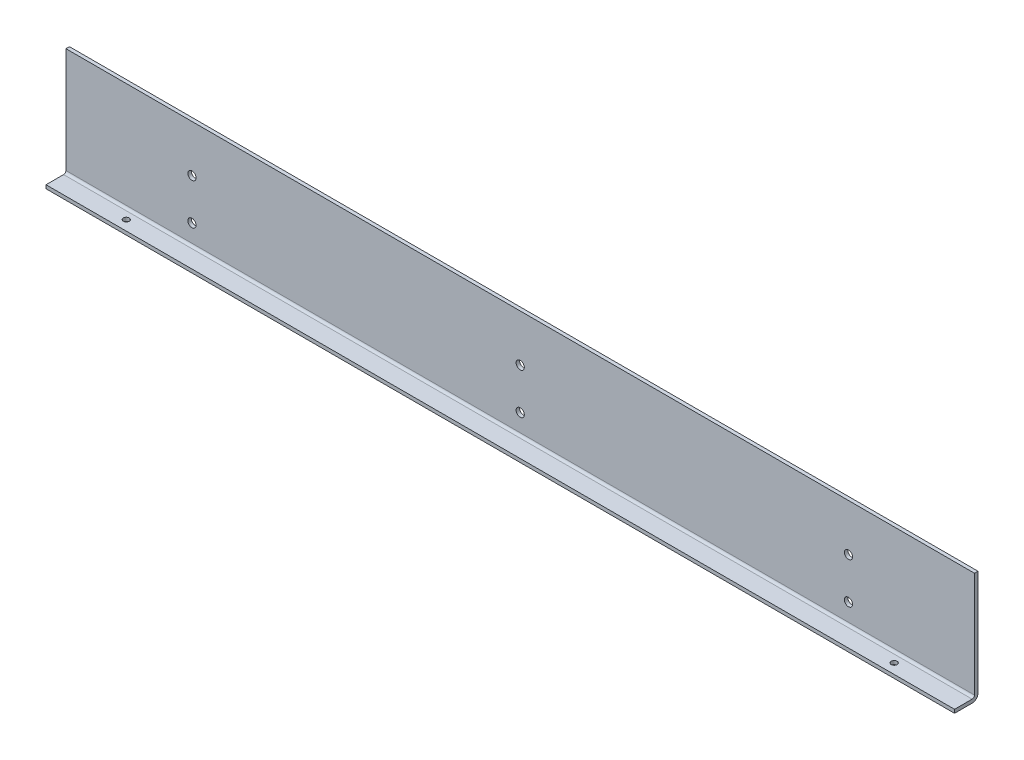
ISO-10303-21;
HEADER;
FILE_DESCRIPTION(('STEP AP214'),'2;1');
FILE_NAME('part.step','',(''),(''),'','','');
FILE_SCHEMA(('AUTOMOTIVE_DESIGN { 1 0 10303 214 1 1 1 1 }'));
ENDSEC;
DATA;
#1=APPLICATION_CONTEXT('core data for automotive mechanical design processes');
#2=APPLICATION_PROTOCOL_DEFINITION('international standard','automotive_design',2000,#1);
#3=PRODUCT_CONTEXT('',#1,'mechanical');
#4=PRODUCT('Part','Part','',(#3));
#5=PRODUCT_RELATED_PRODUCT_CATEGORY('part','',(#4));
#6=PRODUCT_DEFINITION_FORMATION('','',#4);
#7=PRODUCT_DEFINITION_CONTEXT('part definition',#1,'design');
#8=PRODUCT_DEFINITION('design','',#6,#7);
#9=PRODUCT_DEFINITION_SHAPE('','',#8);
#10=(LENGTH_UNIT() NAMED_UNIT(*) SI_UNIT(.MILLI.,.METRE.));
#11=(NAMED_UNIT(*) PLANE_ANGLE_UNIT() SI_UNIT($,.RADIAN.));
#12=(NAMED_UNIT(*) SI_UNIT($,.STERADIAN.) SOLID_ANGLE_UNIT());
#13=UNCERTAINTY_MEASURE_WITH_UNIT(LENGTH_MEASURE(1.E-05),#10,'distance_accuracy_value','');
#14=(GEOMETRIC_REPRESENTATION_CONTEXT(3) GLOBAL_UNCERTAINTY_ASSIGNED_CONTEXT((#13)) GLOBAL_UNIT_ASSIGNED_CONTEXT((#10,
#11,#12)) REPRESENTATION_CONTEXT('',''));
#15=CARTESIAN_POINT('',(0.,0.,0.));
#16=DIRECTION('',(0.,0.,1.));
#17=DIRECTION('',(1.,0.,0.));
#18=AXIS2_PLACEMENT_3D('',#15,#16,#17);
#19=CARTESIAN_POINT('',(0.,0.,3.));
#20=DIRECTION('',(0.,0.,-1.));
#21=DIRECTION('',(-1.,0.,0.));
#22=AXIS2_PLACEMENT_3D('',#19,#20,#21);
#23=PLANE('',#22);
#24=CARTESIAN_POINT('',(667.5,55.,3.));
#25=DIRECTION('',(0.,0.,1.));
#26=DIRECTION('',(1.,0.,0.));
#27=AXIS2_PLACEMENT_3D('',#24,#25,#26);
#28=CIRCLE('',#27,3.49999999999996);
#29=CARTESIAN_POINT('',(671.,55.,3.));
#30=VERTEX_POINT('',#29);
#31=EDGE_CURVE('E262',#30,#30,#28,.T.);
#32=ORIENTED_EDGE('',*,*,#31,.F.);
#33=EDGE_LOOP('',(#32));
#34=FACE_BOUND('',#33,.T.);
#35=CARTESIAN_POINT('',(387.5,20.,3.));
#36=DIRECTION('',(0.,0.,1.));
#37=DIRECTION('',(1.,0.,0.));
#38=AXIS2_PLACEMENT_3D('',#35,#36,#37);
#39=CIRCLE('',#38,3.50000000000002);
#40=CARTESIAN_POINT('',(391.,20.,3.));
#41=VERTEX_POINT('',#40);
#42=EDGE_CURVE('E263',#41,#41,#39,.T.);
#43=ORIENTED_EDGE('',*,*,#42,.F.);
#44=EDGE_LOOP('',(#43));
#45=FACE_BOUND('',#44,.T.);
#46=CARTESIAN_POINT('',(387.5,55.,3.));
#47=DIRECTION('',(0.,0.,1.));
#48=DIRECTION('',(1.,0.,0.));
#49=AXIS2_PLACEMENT_3D('',#46,#47,#48);
#50=CIRCLE('',#49,3.50000000000002);
#51=CARTESIAN_POINT('',(391.,55.,3.));
#52=VERTEX_POINT('',#51);
#53=EDGE_CURVE('E266',#52,#52,#50,.T.);
#54=ORIENTED_EDGE('',*,*,#53,.F.);
#55=EDGE_LOOP('',(#54));
#56=FACE_BOUND('',#55,.T.);
#57=CARTESIAN_POINT('',(107.5,20.,3.));
#58=DIRECTION('',(0.,0.,1.));
#59=DIRECTION('',(1.,0.,0.));
#60=AXIS2_PLACEMENT_3D('',#57,#58,#59);
#61=CIRCLE('',#60,3.50000000000001);
#62=CARTESIAN_POINT('',(111.,20.,3.));
#63=VERTEX_POINT('',#62);
#64=EDGE_CURVE('E269',#63,#63,#61,.T.);
#65=ORIENTED_EDGE('',*,*,#64,.F.);
#66=EDGE_LOOP('',(#65));
#67=FACE_BOUND('',#66,.T.);
#68=CARTESIAN_POINT('',(667.5,20.,3.));
#69=DIRECTION('',(0.,0.,1.));
#70=DIRECTION('',(1.,0.,0.));
#71=AXIS2_PLACEMENT_3D('',#68,#69,#70);
#72=CIRCLE('',#71,3.49999999999996);
#73=CARTESIAN_POINT('',(671.,20.,3.));
#74=VERTEX_POINT('',#73);
#75=EDGE_CURVE('E253',#74,#74,#72,.T.);
#76=ORIENTED_EDGE('',*,*,#75,.F.);
#77=EDGE_LOOP('',(#76));
#78=FACE_BOUND('',#77,.T.);
#79=CARTESIAN_POINT('',(107.5,55.,3.));
#80=DIRECTION('',(0.,0.,1.));
#81=DIRECTION('',(1.,0.,0.));
#82=AXIS2_PLACEMENT_3D('',#79,#80,#81);
#83=CIRCLE('',#82,3.50000000000001);
#84=CARTESIAN_POINT('',(111.,55.,3.));
#85=VERTEX_POINT('',#84);
#86=EDGE_CURVE('E138',#85,#85,#83,.T.);
#87=ORIENTED_EDGE('',*,*,#86,.F.);
#88=EDGE_LOOP('',(#87));
#89=FACE_BOUND('',#88,.T.);
#90=DIRECTION('',(0.,-1.,0.));
#91=VECTOR('',#90,1.);
#92=CARTESIAN_POINT('',(0.,0.,3.));
#93=LINE('',#92,#91);
#94=CARTESIAN_POINT('',(0.,95.,3.));
#95=VERTEX_POINT('',#94);
#96=CARTESIAN_POINT('',(0.,5.,3.));
#97=VERTEX_POINT('',#96);
#98=EDGE_CURVE('E149',#95,#97,#93,.T.);
#99=ORIENTED_EDGE('',*,*,#98,.T.);
#100=DIRECTION('',(-1.,0.,0.));
#101=VECTOR('',#100,1.);
#102=CARTESIAN_POINT('',(775.,5.,3.));
#103=LINE('',#102,#101);
#104=CARTESIAN_POINT('',(775.,5.,3.));
#105=VERTEX_POINT('',#104);
#106=EDGE_CURVE('E64',#97,#105,#103,.F.);
#107=ORIENTED_EDGE('',*,*,#106,.T.);
#108=DIRECTION('',(0.,1.,0.));
#109=VECTOR('',#108,1.);
#110=CARTESIAN_POINT('',(775.,0.,3.));
#111=LINE('',#110,#109);
#112=CARTESIAN_POINT('',(775.,95.,3.));
#113=VERTEX_POINT('',#112);
#114=EDGE_CURVE('E151',#105,#113,#111,.T.);
#115=ORIENTED_EDGE('',*,*,#114,.T.);
#116=DIRECTION('',(-1.,0.,0.));
#117=VECTOR('',#116,1.);
#118=CARTESIAN_POINT('',(0.,95.,3.));
#119=LINE('',#118,#117);
#120=EDGE_CURVE('E154',#113,#95,#119,.T.);
#121=ORIENTED_EDGE('',*,*,#120,.T.);
#122=EDGE_LOOP('',(#99,#107,#115,#121));
#123=FACE_BOUND('',#122,.T.);
#124=ADVANCED_FACE('F43',(#34,#45,#56,#67,#78,#89,#123),#23,.F.);
#125=CARTESIAN_POINT('',(0.,0.,3.));
#126=DIRECTION('',(1.,0.,0.));
#127=DIRECTION('',(0.,0.,-1.));
#128=AXIS2_PLACEMENT_3D('',#125,#126,#127);
#129=PLANE('',#128);
#130=DIRECTION('',(0.,-1.,0.));
#131=VECTOR('',#130,1.);
#132=CARTESIAN_POINT('',(0.,0.,0.));
#133=LINE('',#132,#131);
#134=CARTESIAN_POINT('',(0.,95.,0.));
#135=VERTEX_POINT('',#134);
#136=CARTESIAN_POINT('',(0.,5.,0.));
#137=VERTEX_POINT('',#136);
#138=EDGE_CURVE('E148',#135,#137,#133,.T.);
#139=ORIENTED_EDGE('',*,*,#138,.T.);
#140=CARTESIAN_POINT('',(0.,5.,5.));
#141=DIRECTION('',(1.,0.,0.));
#142=DIRECTION('',(0.,0.,-1.));
#143=AXIS2_PLACEMENT_3D('',#140,#141,#142);
#144=CIRCLE('',#143,5.);
#145=CARTESIAN_POINT('',(0.,0.,5.));
#146=VERTEX_POINT('',#145);
#147=EDGE_CURVE('E113',#137,#146,#144,.F.);
#148=ORIENTED_EDGE('',*,*,#147,.T.);
#149=DIRECTION('',(0.,0.,-1.));
#150=VECTOR('',#149,1.);
#151=CARTESIAN_POINT('',(0.,0.,3.));
#152=LINE('',#151,#150);
#153=CARTESIAN_POINT('',(0.,0.,20.));
#154=VERTEX_POINT('',#153);
#155=EDGE_CURVE('E106',#154,#146,#152,.T.);
#156=ORIENTED_EDGE('',*,*,#155,.F.);
#157=DIRECTION('',(0.,-1.,0.));
#158=VECTOR('',#157,1.);
#159=CARTESIAN_POINT('',(0.,0.,20.));
#160=LINE('',#159,#158);
#161=CARTESIAN_POINT('',(0.,3.,20.));
#162=VERTEX_POINT('',#161);
#163=EDGE_CURVE('E111',#162,#154,#160,.T.);
#164=ORIENTED_EDGE('',*,*,#163,.F.);
#165=DIRECTION('',(0.,0.,-1.));
#166=VECTOR('',#165,1.);
#167=CARTESIAN_POINT('',(0.,3.,20.));
#168=LINE('',#167,#166);
#169=CARTESIAN_POINT('',(0.,3.,5.));
#170=VERTEX_POINT('',#169);
#171=EDGE_CURVE('E143',#162,#170,#168,.T.);
#172=ORIENTED_EDGE('',*,*,#171,.T.);
#173=CARTESIAN_POINT('',(0.,5.,5.));
#174=DIRECTION('',(1.,0.,0.));
#175=DIRECTION('',(0.,0.,-1.));
#176=AXIS2_PLACEMENT_3D('',#173,#174,#175);
#177=CIRCLE('',#176,2.);
#178=EDGE_CURVE('E51',#170,#97,#177,.T.);
#179=ORIENTED_EDGE('',*,*,#178,.T.);
#180=ORIENTED_EDGE('',*,*,#98,.F.);
#181=DIRECTION('',(0.,0.,-1.));
#182=VECTOR('',#181,1.);
#183=CARTESIAN_POINT('',(0.,95.,3.));
#184=LINE('',#183,#182);
#185=EDGE_CURVE('E156',#95,#135,#184,.T.);
#186=ORIENTED_EDGE('',*,*,#185,.T.);
#187=EDGE_LOOP('',(#139,#148,#156,#164,#172,#179,#180,#186));
#188=FACE_BOUND('',#187,.T.);
#189=ADVANCED_FACE('F109',(#188),#129,.F.);
#190=CARTESIAN_POINT('',(0.,0.,3.));
#191=DIRECTION('',(0.,1.,0.));
#192=DIRECTION('',(0.,0.,1.));
#193=AXIS2_PLACEMENT_3D('',#190,#191,#192);
#194=PLANE('',#193);
#195=CARTESIAN_POINT('',(60.,0.,11.5));
#196=DIRECTION('',(0.,1.,0.));
#197=DIRECTION('',(0.,0.,1.));
#198=AXIS2_PLACEMENT_3D('',#195,#196,#197);
#199=CIRCLE('',#198,2.5);
#200=CARTESIAN_POINT('',(60.,0.,14.));
#201=VERTEX_POINT('',#200);
#202=EDGE_CURVE('E246',#201,#201,#199,.T.);
#203=ORIENTED_EDGE('',*,*,#202,.T.);
#204=EDGE_LOOP('',(#203));
#205=FACE_BOUND('',#204,.T.);
#206=CARTESIAN_POINT('',(715.,0.,11.5));
#207=DIRECTION('',(0.,1.,0.));
#208=DIRECTION('',(0.,0.,1.));
#209=AXIS2_PLACEMENT_3D('',#206,#207,#208);
#210=CIRCLE('',#209,2.49999999999991);
#211=CARTESIAN_POINT('',(715.,0.,13.9999999999999));
#212=VERTEX_POINT('',#211);
#213=EDGE_CURVE('E249',#212,#212,#210,.T.);
#214=ORIENTED_EDGE('',*,*,#213,.T.);
#215=EDGE_LOOP('',(#214));
#216=FACE_BOUND('',#215,.T.);
#217=ORIENTED_EDGE('',*,*,#155,.T.);
#218=DIRECTION('',(1.,0.,0.));
#219=VECTOR('',#218,1.);
#220=CARTESIAN_POINT('',(775.,0.,5.));
#221=LINE('',#220,#219);
#222=CARTESIAN_POINT('',(775.,0.,5.));
#223=VERTEX_POINT('',#222);
#224=EDGE_CURVE('E117',#146,#223,#221,.T.);
#225=ORIENTED_EDGE('',*,*,#224,.T.);
#226=DIRECTION('',(0.,0.,-1.));
#227=VECTOR('',#226,1.);
#228=CARTESIAN_POINT('',(775.,0.,3.));
#229=LINE('',#228,#227);
#230=CARTESIAN_POINT('',(775.,0.,20.));
#231=VERTEX_POINT('',#230);
#232=EDGE_CURVE('E118',#231,#223,#229,.T.);
#233=ORIENTED_EDGE('',*,*,#232,.F.);
#234=DIRECTION('',(1.,0.,0.));
#235=VECTOR('',#234,1.);
#236=CARTESIAN_POINT('',(0.,0.,20.));
#237=LINE('',#236,#235);
#238=EDGE_CURVE('E121',#154,#231,#237,.T.);
#239=ORIENTED_EDGE('',*,*,#238,.F.);
#240=EDGE_LOOP('',(#217,#225,#233,#239));
#241=FACE_BOUND('',#240,.T.);
#242=ADVANCED_FACE('F122',(#205,#216,#241),#194,.F.);
#243=CARTESIAN_POINT('',(775.,0.,3.));
#244=DIRECTION('',(-1.,0.,0.));
#245=DIRECTION('',(0.,0.,1.));
#246=AXIS2_PLACEMENT_3D('',#243,#244,#245);
#247=PLANE('',#246);
#248=ORIENTED_EDGE('',*,*,#232,.T.);
#249=CARTESIAN_POINT('',(775.,5.,5.));
#250=DIRECTION('',(-1.,0.,0.));
#251=DIRECTION('',(0.,0.,1.));
#252=AXIS2_PLACEMENT_3D('',#249,#250,#251);
#253=CIRCLE('',#252,5.);
#254=CARTESIAN_POINT('',(775.,5.,0.));
#255=VERTEX_POINT('',#254);
#256=EDGE_CURVE('E182',#223,#255,#253,.F.);
#257=ORIENTED_EDGE('',*,*,#256,.T.);
#258=DIRECTION('',(0.,1.,0.));
#259=VECTOR('',#258,1.);
#260=CARTESIAN_POINT('',(775.,0.,0.));
#261=LINE('',#260,#259);
#262=CARTESIAN_POINT('',(775.,95.,0.));
#263=VERTEX_POINT('',#262);
#264=EDGE_CURVE('E158',#255,#263,#261,.T.);
#265=ORIENTED_EDGE('',*,*,#264,.T.);
#266=DIRECTION('',(0.,0.,-1.));
#267=VECTOR('',#266,1.);
#268=CARTESIAN_POINT('',(775.,95.,3.));
#269=LINE('',#268,#267);
#270=EDGE_CURVE('E163',#113,#263,#269,.T.);
#271=ORIENTED_EDGE('',*,*,#270,.F.);
#272=ORIENTED_EDGE('',*,*,#114,.F.);
#273=CARTESIAN_POINT('',(775.,5.,5.));
#274=DIRECTION('',(-1.,0.,0.));
#275=DIRECTION('',(0.,0.,1.));
#276=AXIS2_PLACEMENT_3D('',#273,#274,#275);
#277=CIRCLE('',#276,2.);
#278=CARTESIAN_POINT('',(775.,3.,5.));
#279=VERTEX_POINT('',#278);
#280=EDGE_CURVE('E11',#105,#279,#277,.T.);
#281=ORIENTED_EDGE('',*,*,#280,.T.);
#282=DIRECTION('',(0.,0.,-1.));
#283=VECTOR('',#282,1.);
#284=CARTESIAN_POINT('',(775.,3.,20.));
#285=LINE('',#284,#283);
#286=CARTESIAN_POINT('',(775.,3.,20.));
#287=VERTEX_POINT('',#286);
#288=EDGE_CURVE('E145',#287,#279,#285,.T.);
#289=ORIENTED_EDGE('',*,*,#288,.F.);
#290=DIRECTION('',(0.,1.,0.));
#291=VECTOR('',#290,1.);
#292=CARTESIAN_POINT('',(775.,0.,20.));
#293=LINE('',#292,#291);
#294=EDGE_CURVE('E126',#231,#287,#293,.T.);
#295=ORIENTED_EDGE('',*,*,#294,.F.);
#296=EDGE_LOOP('',(#248,#257,#265,#271,#272,#281,#289,#295));
#297=FACE_BOUND('',#296,.T.);
#298=ADVANCED_FACE('F197',(#297),#247,.F.);
#299=CARTESIAN_POINT('',(0.,95.,3.));
#300=DIRECTION('',(0.,-1.,0.));
#301=DIRECTION('',(0.,0.,-1.));
#302=AXIS2_PLACEMENT_3D('',#299,#300,#301);
#303=PLANE('',#302);
#304=DIRECTION('',(-1.,0.,0.));
#305=VECTOR('',#304,1.);
#306=CARTESIAN_POINT('',(0.,95.,0.));
#307=LINE('',#306,#305);
#308=EDGE_CURVE('E152',#263,#135,#307,.T.);
#309=ORIENTED_EDGE('',*,*,#308,.T.);
#310=ORIENTED_EDGE('',*,*,#185,.F.);
#311=ORIENTED_EDGE('',*,*,#120,.F.);
#312=ORIENTED_EDGE('',*,*,#270,.T.);
#313=EDGE_LOOP('',(#309,#310,#311,#312));
#314=FACE_BOUND('',#313,.T.);
#315=ADVANCED_FACE('F202',(#314),#303,.F.);
#316=CARTESIAN_POINT('',(0.,0.,0.));
#317=DIRECTION('',(0.,0.,-1.));
#318=DIRECTION('',(-1.,0.,0.));
#319=AXIS2_PLACEMENT_3D('',#316,#317,#318);
#320=PLANE('',#319);
#321=CARTESIAN_POINT('',(667.5,55.,0.));
#322=DIRECTION('',(0.,0.,-1.));
#323=DIRECTION('',(-1.,0.,0.));
#324=AXIS2_PLACEMENT_3D('',#321,#322,#323);
#325=CIRCLE('',#324,3.49999999999996);
#326=CARTESIAN_POINT('',(664.,55.,0.));
#327=VERTEX_POINT('',#326);
#328=EDGE_CURVE('E132',#327,#327,#325,.T.);
#329=ORIENTED_EDGE('',*,*,#328,.F.);
#330=EDGE_LOOP('',(#329));
#331=FACE_BOUND('',#330,.T.);
#332=CARTESIAN_POINT('',(387.5,20.,0.));
#333=DIRECTION('',(0.,0.,-1.));
#334=DIRECTION('',(-1.,0.,0.));
#335=AXIS2_PLACEMENT_3D('',#332,#333,#334);
#336=CIRCLE('',#335,3.50000000000002);
#337=CARTESIAN_POINT('',(384.,20.,0.));
#338=VERTEX_POINT('',#337);
#339=EDGE_CURVE('E135',#338,#338,#336,.T.);
#340=ORIENTED_EDGE('',*,*,#339,.F.);
#341=EDGE_LOOP('',(#340));
#342=FACE_BOUND('',#341,.T.);
#343=CARTESIAN_POINT('',(387.5,55.,0.));
#344=DIRECTION('',(0.,0.,-1.));
#345=DIRECTION('',(-1.,0.,0.));
#346=AXIS2_PLACEMENT_3D('',#343,#344,#345);
#347=CIRCLE('',#346,3.50000000000002);
#348=CARTESIAN_POINT('',(384.,55.,0.));
#349=VERTEX_POINT('',#348);
#350=EDGE_CURVE('E176',#349,#349,#347,.T.);
#351=ORIENTED_EDGE('',*,*,#350,.F.);
#352=EDGE_LOOP('',(#351));
#353=FACE_BOUND('',#352,.T.);
#354=CARTESIAN_POINT('',(107.5,20.,0.));
#355=DIRECTION('',(0.,0.,-1.));
#356=DIRECTION('',(-1.,0.,0.));
#357=AXIS2_PLACEMENT_3D('',#354,#355,#356);
#358=CIRCLE('',#357,3.50000000000001);
#359=CARTESIAN_POINT('',(104.,20.,0.));
#360=VERTEX_POINT('',#359);
#361=EDGE_CURVE('E173',#360,#360,#358,.T.);
#362=ORIENTED_EDGE('',*,*,#361,.F.);
#363=EDGE_LOOP('',(#362));
#364=FACE_BOUND('',#363,.T.);
#365=CARTESIAN_POINT('',(667.5,20.,0.));
#366=DIRECTION('',(0.,0.,-1.));
#367=DIRECTION('',(-1.,0.,0.));
#368=AXIS2_PLACEMENT_3D('',#365,#366,#367);
#369=CIRCLE('',#368,3.49999999999996);
#370=CARTESIAN_POINT('',(664.,20.,0.));
#371=VERTEX_POINT('',#370);
#372=EDGE_CURVE('E170',#371,#371,#369,.T.);
#373=ORIENTED_EDGE('',*,*,#372,.F.);
#374=EDGE_LOOP('',(#373));
#375=FACE_BOUND('',#374,.T.);
#376=CARTESIAN_POINT('',(107.5,55.,0.));
#377=DIRECTION('',(0.,0.,-1.));
#378=DIRECTION('',(-1.,0.,0.));
#379=AXIS2_PLACEMENT_3D('',#376,#377,#378);
#380=CIRCLE('',#379,3.50000000000001);
#381=CARTESIAN_POINT('',(104.,55.,0.));
#382=VERTEX_POINT('',#381);
#383=EDGE_CURVE('E167',#382,#382,#380,.T.);
#384=ORIENTED_EDGE('',*,*,#383,.F.);
#385=EDGE_LOOP('',(#384));
#386=FACE_BOUND('',#385,.T.);
#387=ORIENTED_EDGE('',*,*,#264,.F.);
#388=DIRECTION('',(1.,0.,0.));
#389=VECTOR('',#388,1.);
#390=CARTESIAN_POINT('',(0.,5.,0.));
#391=LINE('',#390,#389);
#392=EDGE_CURVE('E184',#255,#137,#391,.F.);
#393=ORIENTED_EDGE('',*,*,#392,.T.);
#394=ORIENTED_EDGE('',*,*,#138,.F.);
#395=ORIENTED_EDGE('',*,*,#308,.F.);
#396=EDGE_LOOP('',(#387,#393,#394,#395));
#397=FACE_BOUND('',#396,.T.);
#398=ADVANCED_FACE('F207',(#331,#342,#353,#364,#375,#386,#397),#320,.T.);
#399=CARTESIAN_POINT('',(0.,3.,20.));
#400=DIRECTION('',(0.,-1.,0.));
#401=DIRECTION('',(1.,0.,0.));
#402=AXIS2_PLACEMENT_3D('',#399,#400,#401);
#403=PLANE('',#402);
#404=CARTESIAN_POINT('',(60.,3.,11.5));
#405=DIRECTION('',(0.,1.,0.));
#406=DIRECTION('',(0.,0.,1.));
#407=AXIS2_PLACEMENT_3D('',#404,#405,#406);
#408=CIRCLE('',#407,2.5);
#409=CARTESIAN_POINT('',(60.,3.,14.));
#410=VERTEX_POINT('',#409);
#411=EDGE_CURVE('E251',#410,#410,#408,.T.);
#412=ORIENTED_EDGE('',*,*,#411,.F.);
#413=EDGE_LOOP('',(#412));
#414=FACE_BOUND('',#413,.T.);
#415=CARTESIAN_POINT('',(715.,3.,11.5));
#416=DIRECTION('',(0.,1.,0.));
#417=DIRECTION('',(0.,0.,1.));
#418=AXIS2_PLACEMENT_3D('',#415,#416,#417);
#419=CIRCLE('',#418,2.49999999999991);
#420=CARTESIAN_POINT('',(715.,3.,13.9999999999999));
#421=VERTEX_POINT('',#420);
#422=EDGE_CURVE('E256',#421,#421,#419,.T.);
#423=ORIENTED_EDGE('',*,*,#422,.F.);
#424=EDGE_LOOP('',(#423));
#425=FACE_BOUND('',#424,.T.);
#426=ORIENTED_EDGE('',*,*,#288,.T.);
#427=DIRECTION('',(-1.,0.,0.));
#428=VECTOR('',#427,1.);
#429=CARTESIAN_POINT('',(0.,3.,5.));
#430=LINE('',#429,#428);
#431=EDGE_CURVE('E187',#279,#170,#430,.T.);
#432=ORIENTED_EDGE('',*,*,#431,.T.);
#433=ORIENTED_EDGE('',*,*,#171,.F.);
#434=DIRECTION('',(-1.,0.,0.));
#435=VECTOR('',#434,1.);
#436=CARTESIAN_POINT('',(0.,3.,20.));
#437=LINE('',#436,#435);
#438=EDGE_CURVE('E130',#287,#162,#437,.T.);
#439=ORIENTED_EDGE('',*,*,#438,.F.);
#440=EDGE_LOOP('',(#426,#432,#433,#439));
#441=FACE_BOUND('',#440,.T.);
#442=ADVANCED_FACE('F192',(#414,#425,#441),#403,.F.);
#443=CARTESIAN_POINT('',(0.,0.,20.));
#444=DIRECTION('',(0.,0.,-1.));
#445=DIRECTION('',(-1.,0.,0.));
#446=AXIS2_PLACEMENT_3D('',#443,#444,#445);
#447=PLANE('',#446);
#448=ORIENTED_EDGE('',*,*,#163,.T.);
#449=ORIENTED_EDGE('',*,*,#238,.T.);
#450=ORIENTED_EDGE('',*,*,#294,.T.);
#451=ORIENTED_EDGE('',*,*,#438,.T.);
#452=EDGE_LOOP('',(#448,#449,#450,#451));
#453=FACE_BOUND('',#452,.T.);
#454=ADVANCED_FACE('F128',(#453),#447,.F.);
#455=CARTESIAN_POINT('',(107.5,55.,-14.));
#456=DIRECTION('',(0.,0.,1.));
#457=DIRECTION('',(1.,0.,0.));
#458=AXIS2_PLACEMENT_3D('',#455,#456,#457);
#459=CYLINDRICAL_SURFACE('',#458,3.50000000000001);
#460=ORIENTED_EDGE('',*,*,#383,.T.);
#461=EDGE_LOOP('',(#460));
#462=FACE_BOUND('',#461,.T.);
#463=ORIENTED_EDGE('',*,*,#86,.T.);
#464=EDGE_LOOP('',(#463));
#465=FACE_BOUND('',#464,.T.);
#466=ADVANCED_FACE('F284',(#462,#465),#459,.F.);
#467=CARTESIAN_POINT('',(667.5,20.,-14.));
#468=DIRECTION('',(0.,0.,1.));
#469=DIRECTION('',(1.,0.,0.));
#470=AXIS2_PLACEMENT_3D('',#467,#468,#469);
#471=CYLINDRICAL_SURFACE('',#470,3.49999999999996);
#472=ORIENTED_EDGE('',*,*,#372,.T.);
#473=EDGE_LOOP('',(#472));
#474=FACE_BOUND('',#473,.T.);
#475=ORIENTED_EDGE('',*,*,#75,.T.);
#476=EDGE_LOOP('',(#475));
#477=FACE_BOUND('',#476,.T.);
#478=ADVANCED_FACE('F286',(#474,#477),#471,.F.);
#479=CARTESIAN_POINT('',(107.5,20.,-14.));
#480=DIRECTION('',(0.,0.,1.));
#481=DIRECTION('',(1.,0.,0.));
#482=AXIS2_PLACEMENT_3D('',#479,#480,#481);
#483=CYLINDRICAL_SURFACE('',#482,3.50000000000001);
#484=ORIENTED_EDGE('',*,*,#361,.T.);
#485=EDGE_LOOP('',(#484));
#486=FACE_BOUND('',#485,.T.);
#487=ORIENTED_EDGE('',*,*,#64,.T.);
#488=EDGE_LOOP('',(#487));
#489=FACE_BOUND('',#488,.T.);
#490=ADVANCED_FACE('F293',(#486,#489),#483,.F.);
#491=CARTESIAN_POINT('',(387.5,55.,-14.));
#492=DIRECTION('',(0.,0.,1.));
#493=DIRECTION('',(1.,0.,0.));
#494=AXIS2_PLACEMENT_3D('',#491,#492,#493);
#495=CYLINDRICAL_SURFACE('',#494,3.50000000000002);
#496=ORIENTED_EDGE('',*,*,#350,.T.);
#497=EDGE_LOOP('',(#496));
#498=FACE_BOUND('',#497,.T.);
#499=ORIENTED_EDGE('',*,*,#53,.T.);
#500=EDGE_LOOP('',(#499));
#501=FACE_BOUND('',#500,.T.);
#502=ADVANCED_FACE('F274',(#498,#501),#495,.F.);
#503=CARTESIAN_POINT('',(387.5,20.,-14.));
#504=DIRECTION('',(0.,0.,1.));
#505=DIRECTION('',(1.,0.,0.));
#506=AXIS2_PLACEMENT_3D('',#503,#504,#505);
#507=CYLINDRICAL_SURFACE('',#506,3.50000000000002);
#508=ORIENTED_EDGE('',*,*,#339,.T.);
#509=EDGE_LOOP('',(#508));
#510=FACE_BOUND('',#509,.T.);
#511=ORIENTED_EDGE('',*,*,#42,.T.);
#512=EDGE_LOOP('',(#511));
#513=FACE_BOUND('',#512,.T.);
#514=ADVANCED_FACE('F299',(#510,#513),#507,.F.);
#515=CARTESIAN_POINT('',(667.5,55.,-14.));
#516=DIRECTION('',(0.,0.,1.));
#517=DIRECTION('',(1.,0.,0.));
#518=AXIS2_PLACEMENT_3D('',#515,#516,#517);
#519=CYLINDRICAL_SURFACE('',#518,3.49999999999996);
#520=ORIENTED_EDGE('',*,*,#328,.T.);
#521=EDGE_LOOP('',(#520));
#522=FACE_BOUND('',#521,.T.);
#523=ORIENTED_EDGE('',*,*,#31,.T.);
#524=EDGE_LOOP('',(#523));
#525=FACE_BOUND('',#524,.T.);
#526=ADVANCED_FACE('F304',(#522,#525),#519,.F.);
#527=CARTESIAN_POINT('',(715.,-14.,11.5));
#528=DIRECTION('',(0.,1.,0.));
#529=DIRECTION('',(0.,0.,1.));
#530=AXIS2_PLACEMENT_3D('',#527,#528,#529);
#531=CYLINDRICAL_SURFACE('',#530,2.49999999999991);
#532=ORIENTED_EDGE('',*,*,#422,.T.);
#533=EDGE_LOOP('',(#532));
#534=FACE_BOUND('',#533,.T.);
#535=ORIENTED_EDGE('',*,*,#213,.F.);
#536=EDGE_LOOP('',(#535));
#537=FACE_BOUND('',#536,.T.);
#538=ADVANCED_FACE('F219',(#534,#537),#531,.F.);
#539=CARTESIAN_POINT('',(60.,-14.,11.5));
#540=DIRECTION('',(0.,1.,0.));
#541=DIRECTION('',(0.,0.,1.));
#542=AXIS2_PLACEMENT_3D('',#539,#540,#541);
#543=CYLINDRICAL_SURFACE('',#542,2.5);
#544=ORIENTED_EDGE('',*,*,#411,.T.);
#545=EDGE_LOOP('',(#544));
#546=FACE_BOUND('',#545,.T.);
#547=ORIENTED_EDGE('',*,*,#202,.F.);
#548=EDGE_LOOP('',(#547));
#549=FACE_BOUND('',#548,.T.);
#550=ADVANCED_FACE('F212',(#546,#549),#543,.F.);
#551=CARTESIAN_POINT('',(0.,5.,5.));
#552=DIRECTION('',(-1.,0.,0.));
#553=DIRECTION('',(0.,0.,1.));
#554=AXIS2_PLACEMENT_3D('',#551,#552,#553);
#555=CYLINDRICAL_SURFACE('',#554,5.);
#556=ORIENTED_EDGE('',*,*,#147,.F.);
#557=ORIENTED_EDGE('',*,*,#392,.F.);
#558=ORIENTED_EDGE('',*,*,#256,.F.);
#559=ORIENTED_EDGE('',*,*,#224,.F.);
#560=EDGE_LOOP('',(#556,#557,#558,#559));
#561=FACE_BOUND('',#560,.T.);
#562=ADVANCED_FACE('F210',(#561),#555,.T.);
#563=CARTESIAN_POINT('',(0.,5.,5.));
#564=DIRECTION('',(1.,0.,0.));
#565=DIRECTION('',(0.,1.,0.));
#566=AXIS2_PLACEMENT_3D('',#563,#564,#565);
#567=CYLINDRICAL_SURFACE('',#566,2.);
#568=ORIENTED_EDGE('',*,*,#280,.F.);
#569=ORIENTED_EDGE('',*,*,#106,.F.);
#570=ORIENTED_EDGE('',*,*,#178,.F.);
#571=ORIENTED_EDGE('',*,*,#431,.F.);
#572=EDGE_LOOP('',(#568,#569,#570,#571));
#573=FACE_BOUND('',#572,.T.);
#574=ADVANCED_FACE('F45',(#573),#567,.F.);
#575=CLOSED_SHELL('',(#124,#189,#242,#298,#315,#398,#442,#454,#466,#478,#490,#502,#514,#526,
#538,#550,#562,#574));
#576=MANIFOLD_SOLID_BREP('B2',#575);
#577=ADVANCED_BREP_SHAPE_REPRESENTATION('',(#18,#576),#14);
#578=SHAPE_DEFINITION_REPRESENTATION(#9,#577);
ENDSEC;
END-ISO-10303-21;
